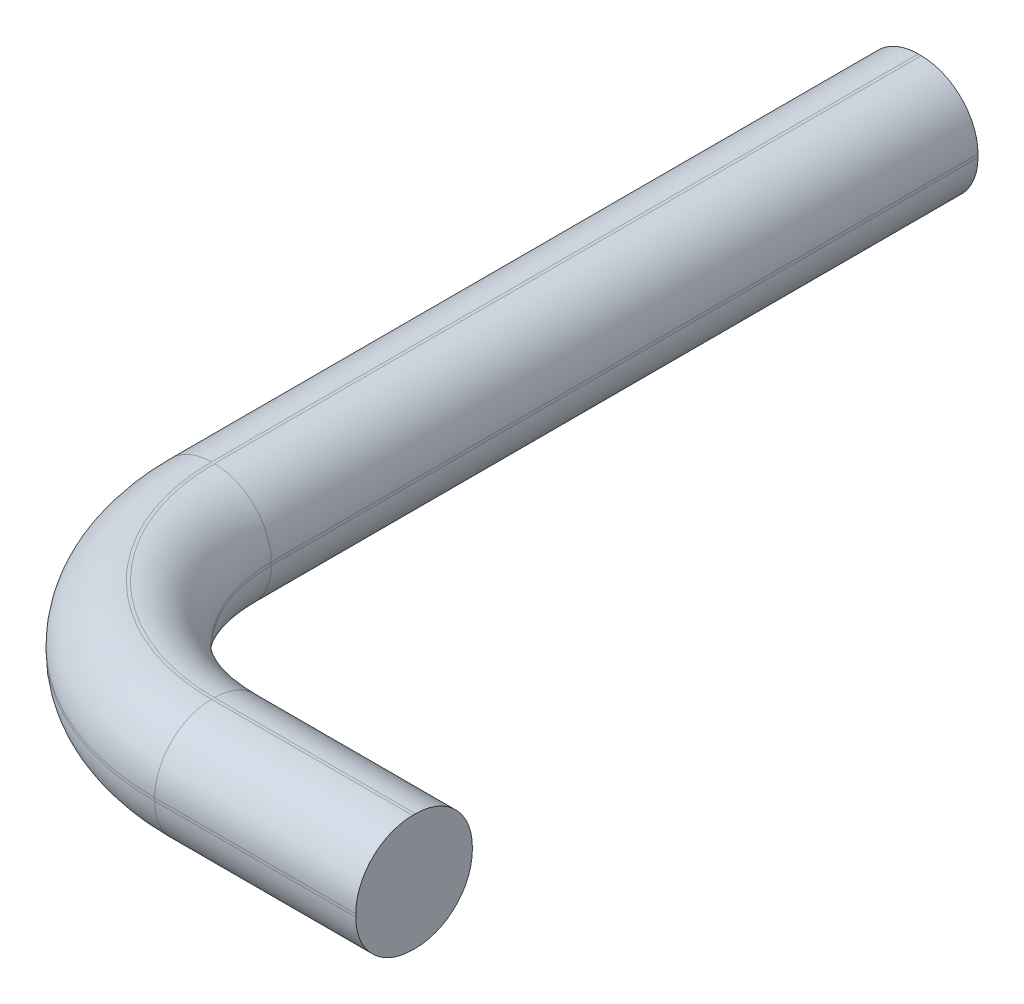
ISO-10303-21;
HEADER;
FILE_DESCRIPTION(('STEP AP214'),'2;1');
FILE_NAME('part.step','',(''),(''),'','','');
FILE_SCHEMA(('AUTOMOTIVE_DESIGN { 1 0 10303 214 1 1 1 1 }'));
ENDSEC;
DATA;
#1=APPLICATION_CONTEXT('core data for automotive mechanical design processes');
#2=APPLICATION_PROTOCOL_DEFINITION('international standard','automotive_design',2000,#1);
#3=PRODUCT_CONTEXT('',#1,'mechanical');
#4=PRODUCT('Part','Part','',(#3));
#5=PRODUCT_RELATED_PRODUCT_CATEGORY('part','',(#4));
#6=PRODUCT_DEFINITION_FORMATION('','',#4);
#7=PRODUCT_DEFINITION_CONTEXT('part definition',#1,'design');
#8=PRODUCT_DEFINITION('design','',#6,#7);
#9=PRODUCT_DEFINITION_SHAPE('','',#8);
#10=(LENGTH_UNIT() NAMED_UNIT(*) SI_UNIT(.MILLI.,.METRE.));
#11=(NAMED_UNIT(*) PLANE_ANGLE_UNIT() SI_UNIT($,.RADIAN.));
#12=(NAMED_UNIT(*) SI_UNIT($,.STERADIAN.) SOLID_ANGLE_UNIT());
#13=UNCERTAINTY_MEASURE_WITH_UNIT(LENGTH_MEASURE(1.E-05),#10,'distance_accuracy_value','');
#14=(GEOMETRIC_REPRESENTATION_CONTEXT(3) GLOBAL_UNCERTAINTY_ASSIGNED_CONTEXT((#13)) GLOBAL_UNIT_ASSIGNED_CONTEXT((#10,
#11,#12)) REPRESENTATION_CONTEXT('',''));
#15=CARTESIAN_POINT('',(0.,0.,0.));
#16=DIRECTION('',(0.,0.,1.));
#17=DIRECTION('',(1.,0.,0.));
#18=AXIS2_PLACEMENT_3D('',#15,#16,#17);
#19=CARTESIAN_POINT('',(1.40000174,-0.00999666000000074,1.85000192));
#20=DIRECTION('',(0.,-1.,0.));
#21=DIRECTION('',(0.,0.,-1.));
#22=AXIS2_PLACEMENT_3D('',#19,#20,#21);
#23=TOROIDAL_SURFACE('',#22,1.39,0.39);
#24=CARTESIAN_POINT('',(1.40000174,-0.00999666,1.85000192));
#25=DIRECTION('',(0.,1.,0.));
#26=DIRECTION('',(0.,0.,1.));
#27=AXIS2_PLACEMENT_3D('',#24,#25,#26);
#28=CIRCLE('',#27,1.);
#29=CARTESIAN_POINT('',(0.40000174,-0.00999666000000025,1.85000192));
#30=VERTEX_POINT('',#29);
#31=CARTESIAN_POINT('',(1.40000174,-0.00999665999999999,2.85000192));
#32=VERTEX_POINT('',#31);
#33=EDGE_CURVE('E126',#30,#32,#28,.T.);
#34=ORIENTED_EDGE('',*,*,#33,.T.);
#35=CARTESIAN_POINT('',(1.40000174,-0.009996659999999,3.24000192));
#36=DIRECTION('',(1.,0.,0.));
#37=DIRECTION('',(0.,0.,-1.));
#38=AXIS2_PLACEMENT_3D('',#35,#36,#37);
#39=CIRCLE('',#38,0.39);
#40=CARTESIAN_POINT('',(1.40000174,-0.39999666,3.24000192));
#41=VERTEX_POINT('',#40);
#42=EDGE_CURVE('E138',#41,#32,#39,.T.);
#43=ORIENTED_EDGE('',*,*,#42,.F.);
#44=CARTESIAN_POINT('',(1.40000174,-0.39999666,3.24000192));
#45=CARTESIAN_POINT('',(1.38254161723122,-0.399996659846562,3.23998878020109));
#46=CARTESIAN_POINT('',(1.36508168573159,-0.39999665937058,3.23965037598821));
#47=CARTESIAN_POINT('',(1.33018679765661,-0.399996658604512,3.23832360261938));
#48=CARTESIAN_POINT('',(1.31275184071402,-0.399996658314424,3.23733524312115));
#49=CARTESIAN_POINT('',(1.27793094909572,-0.39999665875108,3.23470912077804));
#50=CARTESIAN_POINT('',(1.26054501448968,-0.399996659477825,3.23307135701083));
#51=CARTESIAN_POINT('',(1.22584538152621,-0.399996659765057,3.22915183592229));
#52=CARTESIAN_POINT('',(1.20853168445276,-0.399996659325524,3.22687006720321));
#53=CARTESIAN_POINT('',(1.17400267740773,-0.399996659451828,3.22165380404335));
#54=CARTESIAN_POINT('',(1.1567873707991,-0.399996660017699,3.2187192874271));
#55=CARTESIAN_POINT('',(1.12737218735258,-0.399996644761964,3.21317048376076));
#56=CARTESIAN_POINT('',(1.11514442041756,-0.399996633575496,3.21070418702725));
#57=CARTESIAN_POINT('',(1.10236463902564,-0.399996634639923,3.20790602573824));
#58=CARTESIAN_POINT('',(1.10176852045032,-0.399996634718802,3.20777499895823));
#59=CARTESIAN_POINT('',(1.09162314515006,-0.399996636176326,3.20553768664782));
#60=CARTESIAN_POINT('',(1.0820970931742,-0.399996639280515,3.20332593874988));
#61=CARTESIAN_POINT('',(1.051542600593,-0.399996647771027,3.19589335358894));
#62=CARTESIAN_POINT('',(1.030607501279,-0.399996651344889,3.19028275899251));
#63=CARTESIAN_POINT('',(0.992813767303309,-0.399996656552856,3.17919680927334));
#64=CARTESIAN_POINT('',(0.975907473205403,-0.39999665842176,3.17388311766191));
#65=CARTESIAN_POINT('',(0.951864766692174,-0.399996659603419,3.16582235503647));
#66=CARTESIAN_POINT('',(0.944640639414638,-0.399996659765442,3.16333441568982));
#67=CARTESIAN_POINT('',(0.920356195575256,-0.399996660120523,3.1547521927208));
#68=CARTESIAN_POINT('',(0.903389544461029,-0.399996660051574,3.14839014551357));
#69=CARTESIAN_POINT('',(0.869336001733168,-0.399996659654266,3.13487121405977));
#70=CARTESIAN_POINT('',(0.852254900333459,-0.399996659320142,3.12769974129958));
#71=CARTESIAN_POINT('',(0.82795004690626,-0.399996654020011,3.1169326222548));
#72=CARTESIAN_POINT('',(0.82060680315735,-0.399996651776191,3.11360460301237));
#73=CARTESIAN_POINT('',(0.803493314382053,-0.399996644896891,3.10566891938135));
#74=CARTESIAN_POINT('',(0.793746429278848,-0.399996639707749,3.10101076492236));
#75=CARTESIAN_POINT('',(0.76709686868581,-0.399996624664594,3.08788586615864));
#76=CARTESIAN_POINT('',(0.750309884486389,-0.399996614230785,3.07918285354314));
#77=CARTESIAN_POINT('',(0.717108351028278,-0.399996595116086,3.0610928515831));
#78=CARTESIAN_POINT('',(0.700693815733734,-0.39999658643526,3.05170583664879));
#79=CARTESIAN_POINT('',(0.668265067277369,-0.399996573560346,3.03226306688683));
#80=CARTESIAN_POINT('',(0.652250862291193,-0.399996569366349,3.02220729841703));
#81=CARTESIAN_POINT('',(0.620650482366615,-0.399996566530954,3.00144432435559));
#82=CARTESIAN_POINT('',(0.605064308875785,-0.399996567889576,2.99073711656121));
#83=CARTESIAN_POINT('',(0.57434616587978,-0.399996575840701,2.96869013944672));
#84=CARTESIAN_POINT('',(0.55921419018123,-0.399996582433133,2.95735037875805));
#85=CARTESIAN_POINT('',(0.529432448483669,-0.399996598941389,2.93405565200829));
#86=CARTESIAN_POINT('',(0.514782667711464,-0.399996608857111,2.92210070482374));
#87=CARTESIAN_POINT('',(0.485982759757446,-0.399996629054595,2.89760410755589));
#88=CARTESIAN_POINT('',(0.471832608779942,-0.399996639336339,2.88506248548028));
#89=CARTESIAN_POINT('',(0.444084771331925,-0.399996654288872,2.85938441115315));
#90=CARTESIAN_POINT('',(0.430487049166163,-0.399996658960023,2.84624799745051));
#91=CARTESIAN_POINT('',(0.410741452787805,-0.399996660496642,2.82649661411751));
#92=CARTESIAN_POINT('',(0.404412953293253,-0.399996660165178,2.82006014749714));
#93=CARTESIAN_POINT('',(0.382652163214097,-0.399996657404838,2.79749417084749));
#94=CARTESIAN_POINT('',(0.367540662068428,-0.399996652605715,2.78105175393447));
#95=CARTESIAN_POINT('',(0.342193059485388,-0.399996635012537,2.75210817704091));
#96=CARTESIAN_POINT('',(0.331764417312967,-0.399996624796593,2.73977461376898));
#97=CARTESIAN_POINT('',(0.314995129558844,-0.399996604989868,2.71922335916537));
#98=CARTESIAN_POINT('',(0.308525786371919,-0.399996596481085,2.71111043215507));
#99=CARTESIAN_POINT('',(0.290288078726695,-0.399996572967514,2.68769872096893));
#100=CARTESIAN_POINT('',(0.278747820338567,-0.399996558670007,2.67222104540047));
#101=CARTESIAN_POINT('',(0.257458984512901,-0.39999654240396,2.64236569349999));
#102=CARTESIAN_POINT('',(0.247646761236898,-0.399996539343315,2.62803325493206));
#103=CARTESIAN_POINT('',(0.227707662016869,-0.399996542017604,2.59768418829407));
#104=CARTESIAN_POINT('',(0.21763336681335,-0.399996548578021,2.58163296022035));
#105=CARTESIAN_POINT('',(0.198153879921357,-0.399996564443457,2.54913034250607));
#106=CARTESIAN_POINT('',(0.188748670222657,-0.399996573748402,2.53267896365265));
#107=CARTESIAN_POINT('',(0.170625420395982,-0.399996594737633,2.49940277501005));
#108=CARTESIAN_POINT('',(0.161907351979788,-0.39999660642182,2.48257798063021));
#109=CARTESIAN_POINT('',(0.145171644702205,-0.399996628592384,2.44858471096724));
#110=CARTESIAN_POINT('',(0.137153967027075,-0.399996639078827,2.43141625479381));
#111=CARTESIAN_POINT('',(0.121837230717636,-0.399996654750107,2.39676312886546));
#112=CARTESIAN_POINT('',(0.114538122022078,-0.399996659935313,2.37927848123957));
#113=CARTESIAN_POINT('',(0.101205077540172,-0.399996660059552,2.34542804965422));
#114=CARTESIAN_POINT('',(0.0951167033537137,-0.39999665577943,2.32908365555782));
#115=CARTESIAN_POINT('',(0.0835391063335781,-0.399996650224027,2.29618492391118));
#116=CARTESIAN_POINT('',(0.0780498570965774,-0.399996648948612,2.27963059564862));
#117=CARTESIAN_POINT('',(0.0676781679102354,-0.399996649772731,2.24633259126403));
#118=CARTESIAN_POINT('',(0.0627957266594672,-0.399996651872257,2.2295889155482));
#119=CARTESIAN_POINT('',(0.0536558747492859,-0.39999666128969,2.19593202897013));
#120=CARTESIAN_POINT('',(0.0493984889731157,-0.399996668607804,2.17901881138711));
#121=CARTESIAN_POINT('',(0.0414660442275104,-0.399996646317901,2.14505300174933));
#122=CARTESIAN_POINT('',(0.0377910328845431,-0.399996616706865,2.12800039841541));
#123=CARTESIAN_POINT('',(0.0329074275812208,-0.399996606910779,2.10258411228187));
#124=CARTESIAN_POINT('',(0.0314045382214364,-0.399996609107714,2.09427651266294));
#125=CARTESIAN_POINT('',(0.026534092804882,-0.399996618857502,2.06586003023302));
#126=CARTESIAN_POINT('',(0.0235371861522367,-0.399996629590212,2.04568616306871));
#127=CARTESIAN_POINT('',(0.019152463531509,-0.39999664394367,2.01089761598544));
#128=CARTESIAN_POINT('',(0.0175490783009313,-0.399996648714616,1.99630952540659));
#129=CARTESIAN_POINT('',(0.0151285559038876,-0.399996654865006,1.97054674289664));
#130=CARTESIAN_POINT('',(0.0142151496779594,-0.399996656779787,1.95938102092349));
#131=CARTESIAN_POINT('',(0.0121278994839748,-0.399996660043117,1.92946172233904));
#132=CARTESIAN_POINT('',(0.011196628661945,-0.399996660129922,1.91069066268616));
#133=CARTESIAN_POINT('',(0.0102204229804734,-0.399996659881553,1.87794357250099));
#134=CARTESIAN_POINT('',(0.0100094391291838,-0.399996659648883,1.86397230233798));
#135=CARTESIAN_POINT('',(0.01000174,-0.39999666,1.85000192));
#136=B_SPLINE_CURVE_WITH_KNOTS('',3,(#44,#45,#46,#47,#48,#49,#50,#51,#52,#53,#54,#55,#56,#57,
#58,#59,#60,#61,#62,#63,#64,#65,#66,#67,#68,#69,#70,#71,#72,#73,#74,#75,#76,#77,#78,#79,#80,#81,
#82,#83,#84,#85,#86,#87,#88,#89,#90,#91,#92,#93,#94,#95,#96,#97,#98,#99,#100,#101,#102,#103,
#104,#105,#106,#107,#108,#109,#110,#111,#112,#113,#114,#115,#116,#117,#118,#119,#120,#121,#122,
#123,#124,#125,#126,#127,#128,#129,#130,#131,#132,#133,#134,#135),.UNSPECIFIED.,.F.,.F.,(4,2,2,
2,2,2,2,2,2,2,2,2,2,2,2,2,2,2,2,2,2,2,2,2,2,2,2,2,2,2,2,2,2,2,2,2,2,2,2,2,2,2,2,2,2,4),(0.,
0.052377462226915,0.104754146193331,0.157130904550227,0.209508589941971,0.261888055005389,
0.299304580452954,0.301135625968602,0.330471991152891,0.395467518809021,0.448619154842294,
0.471540149328903,0.525886551565373,0.58144779728417,0.605633443638485,0.63803901741383,
0.694748386052567,0.751459877382067,0.808172525943378,0.86488536627941,0.921597432935873,
0.978307760462204,1.03501538341254,1.09171933634679,1.1187983502565,1.18576345963672,
1.234208888882,1.26533629215048,1.32323613603675,1.37533264561107,1.43216848939226,
1.48900280270543,1.54583477504139,1.60266359590425,1.65948845481203,1.71180148419425,
1.76411220721947,1.81642281805143,1.86873551078644,1.92105247943796,1.94637854247432,
2.00754130420251,2.05156219356035,2.08516843199477,2.14153466054272,2.1834465073254),.UNSPECIFIED.);
#137=CARTESIAN_POINT('',(0.01000174,-0.39999666,1.85000192));
#138=VERTEX_POINT('',#137);
#139=EDGE_CURVE('E196',#41,#138,#136,.T.);
#140=ORIENTED_EDGE('',*,*,#139,.T.);
#141=CARTESIAN_POINT('',(0.0100017399999999,-0.00999665999999999,1.85000192));
#142=DIRECTION('',(0.,0.,1.));
#143=DIRECTION('',(1.,0.,0.));
#144=AXIS2_PLACEMENT_3D('',#141,#142,#143);
#145=CIRCLE('',#144,0.39);
#146=EDGE_CURVE('E185',#138,#30,#145,.T.);
#147=ORIENTED_EDGE('',*,*,#146,.T.);
#148=EDGE_LOOP('',(#34,#43,#140,#147));
#149=FACE_BOUND('',#148,.T.);
#150=ADVANCED_FACE('F17',(#149),#23,.T.);
#151=CARTESIAN_POINT('',(-0.009996659999999,-0.00999666,1.85000032));
#152=DIRECTION('',(0.,0.,-1.));
#153=DIRECTION('',(0.,1.,0.));
#154=AXIS2_PLACEMENT_3D('',#151,#152,#153);
#155=CYLINDRICAL_SURFACE('',#154,0.39);
#156=CARTESIAN_POINT('',(-0.00999665999999992,-0.00999665999999992,1.85000032));
#157=DIRECTION('',(0.,0.,1.));
#158=DIRECTION('',(1.,0.,0.));
#159=AXIS2_PLACEMENT_3D('',#156,#157,#158);
#160=CIRCLE('',#159,0.39);
#161=CARTESIAN_POINT('',(-0.39999666,-0.00999665999999998,1.85000032));
#162=VERTEX_POINT('',#161);
#163=CARTESIAN_POINT('',(-0.00999665999999955,-0.39999666,1.85000032));
#164=VERTEX_POINT('',#163);
#165=EDGE_CURVE('E115',#162,#164,#160,.T.);
#166=ORIENTED_EDGE('',*,*,#165,.F.);
#167=DIRECTION('',(0.,0.,-1.));
#168=VECTOR('',#167,1.);
#169=CARTESIAN_POINT('',(-0.39999666,-0.00999665999999998,3.65000032));
#170=LINE('',#169,#168);
#171=CARTESIAN_POINT('',(-0.39999666,-0.00999666000000053,-2.99999908));
#172=VERTEX_POINT('',#171);
#173=EDGE_CURVE('E141',#162,#172,#170,.T.);
#174=ORIENTED_EDGE('',*,*,#173,.T.);
#175=CARTESIAN_POINT('',(-0.009996659999999,-0.00999666000000108,-2.99999908));
#176=DIRECTION('',(0.,0.,-1.));
#177=DIRECTION('',(0.,1.,0.));
#178=AXIS2_PLACEMENT_3D('',#175,#176,#177);
#179=CIRCLE('',#178,0.39);
#180=CARTESIAN_POINT('',(-0.00999665999999903,-0.399996660000002,-2.99999908));
#181=VERTEX_POINT('',#180);
#182=EDGE_CURVE('E21',#172,#181,#179,.F.);
#183=ORIENTED_EDGE('',*,*,#182,.T.);
#184=DIRECTION('',(0.,0.,1.));
#185=VECTOR('',#184,1.);
#186=CARTESIAN_POINT('',(-0.00999665999999906,-0.39999666,3.65000032));
#187=LINE('',#186,#185);
#188=EDGE_CURVE('E137',#181,#164,#187,.T.);
#189=ORIENTED_EDGE('',*,*,#188,.T.);
#190=EDGE_LOOP('',(#166,#174,#183,#189));
#191=FACE_BOUND('',#190,.T.);
#192=ADVANCED_FACE('F140',(#191),#155,.T.);
#193=CARTESIAN_POINT('',(1.40000334,-0.00999665999999992,1.85000032));
#194=DIRECTION('',(0.,1.,0.));
#195=DIRECTION('',(0.,0.,1.));
#196=AXIS2_PLACEMENT_3D('',#193,#194,#195);
#197=TOROIDAL_SURFACE('',#196,1.41,0.39);
#198=CARTESIAN_POINT('',(1.40000334,-0.00999665999999998,1.85000032));
#199=DIRECTION('',(0.,-1.,0.));
#200=DIRECTION('',(0.,0.,-1.));
#201=AXIS2_PLACEMENT_3D('',#198,#199,#200);
#202=CIRCLE('',#201,1.8);
#203=CARTESIAN_POINT('',(1.40000334,-0.00999665999999915,3.65000032));
#204=VERTEX_POINT('',#203);
#205=EDGE_CURVE('E163',#162,#204,#202,.F.);
#206=ORIENTED_EDGE('',*,*,#205,.F.);
#207=ORIENTED_EDGE('',*,*,#165,.T.);
#208=CARTESIAN_POINT('',(-0.00999665999999906,-0.39999666,1.85000032));
#209=CARTESIAN_POINT('',(-0.00998352107914238,-0.399996659844928,1.8677115666795));
#210=CARTESIAN_POINT('',(-0.00964041687337694,-0.399996659371566,1.88542262234074));
#211=CARTESIAN_POINT('',(-0.00829485428694371,-0.399996658617031,1.92081940760026));
#212=CARTESIAN_POINT('',(-0.00729240555015082,-0.399996658335855,1.93850513756518));
#213=CARTESIAN_POINT('',(-0.00462872780731383,-0.399996658794413,1.9738268744148));
#214=CARTESIAN_POINT('',(-0.00296749777655909,-0.399996659534147,1.99146288122211));
#215=CARTESIAN_POINT('',(0.00100827684292671,-0.399996659781329,2.02666161427884));
#216=CARTESIAN_POINT('',(0.00332283301906032,-0.399996659288755,2.04422433922292));
#217=CARTESIAN_POINT('',(0.00861403316165931,-0.399996659314685,2.07924999529904));
#218=CARTESIAN_POINT('',(0.0115906995821845,-0.399996659833223,2.09671292302607));
#219=CARTESIAN_POINT('',(0.017219459354537,-0.399996644023387,2.12655115288343));
#220=CARTESIAN_POINT('',(0.019721363457196,-0.39999663246526,2.138954761559));
#221=CARTESIAN_POINT('',(0.0225605069386392,-0.399996633521804,2.15192239303424));
#222=CARTESIAN_POINT('',(0.0226942951905512,-0.399996633601898,2.15253109435625));
#223=CARTESIAN_POINT('',(0.024966229424892,-0.399996635081829,2.16283351493937));
#224=CARTESIAN_POINT('',(0.0272116670991298,-0.399996638334315,2.17250362642836));
#225=CARTESIAN_POINT('',(0.03475291339218,-0.399996647213662,2.20350082757487));
#226=CARTESIAN_POINT('',(0.0404436919135287,-0.399996650932124,2.22473331270553));
#227=CARTESIAN_POINT('',(0.0516867741119526,-0.399996656369164,2.26306005770272));
#228=CARTESIAN_POINT('',(0.0570749862157814,-0.399996658328813,2.28020269563596));
#229=CARTESIAN_POINT('',(0.0652514986321339,-0.399996659574781,2.30459026584079));
#230=CARTESIAN_POINT('',(0.0677772951610093,-0.399996659747435,2.31192405559619));
#231=CARTESIAN_POINT('',(0.0764874677106922,-0.399996660125177,2.33656918365546));
#232=CARTESIAN_POINT('',(0.0829435868406816,-0.399996660050672,2.35378545949878));
#233=CARTESIAN_POINT('',(0.0966583013960084,-0.399996659646231,2.38832919735584));
#234=CARTESIAN_POINT('',(0.103931284132049,-0.399996659310781,2.40565094844071));
#235=CARTESIAN_POINT('',(0.114849205689108,-0.399996653888016,2.43029513414364));
#236=CARTESIAN_POINT('',(0.11822279057757,-0.399996651592008,2.43773872938047));
#237=CARTESIAN_POINT('',(0.126270255897951,-0.399996644544748,2.45509313840785));
#238=CARTESIAN_POINT('',(0.130995441203816,-0.399996639223407,2.46498021517258));
#239=CARTESIAN_POINT('',(0.14430920116342,-0.399996623793766,2.49201308214261));
#240=CARTESIAN_POINT('',(0.153137439764874,-0.399996613088466,2.50904151756117));
#241=CARTESIAN_POINT('',(0.171487719188491,-0.399996593472363,2.54272060042768));
#242=CARTESIAN_POINT('',(0.181009785928912,-0.399996584561626,2.55937123373217));
#243=CARTESIAN_POINT('',(0.200732267513231,-0.399996571342513,2.59226642455449));
#244=CARTESIAN_POINT('',(0.210932696170543,-0.39999656703423,2.608510973794));
#245=CARTESIAN_POINT('',(0.231994349609914,-0.399996564115338,2.64056589209715));
#246=CARTESIAN_POINT('',(0.242855576615449,-0.399996565504749,2.65637625969958));
#247=CARTESIAN_POINT('',(0.265219682990525,-0.399996573655434,2.68753626295645));
#248=CARTESIAN_POINT('',(0.276722553606815,-0.399996580416633,2.70288590489169));
#249=CARTESIAN_POINT('',(0.300352332859584,-0.399996597350539,2.73309605871303));
#250=CARTESIAN_POINT('',(0.312479222363158,-0.399996607523139,2.7479565855729));
#251=CARTESIAN_POINT('',(0.337328162805987,-0.399996628246695,2.77717078076275));
#252=CARTESIAN_POINT('',(0.350050185359657,-0.399996638797631,2.79152447320961));
#253=CARTESIAN_POINT('',(0.376097506736936,-0.39999665413799,2.81967155962971));
#254=CARTESIAN_POINT('',(0.389422766502634,-0.399996658927786,2.83346498976896));
#255=CARTESIAN_POINT('',(0.409471486705325,-0.399996660513074,2.85350761800444));
#256=CARTESIAN_POINT('',(0.416013948305489,-0.399996660174898,2.85993996313712));
#257=CARTESIAN_POINT('',(0.438914871004804,-0.399996657350548,2.88202174482898));
#258=CARTESIAN_POINT('',(0.455590181933389,-0.399996652440644,2.89734631763034));
#259=CARTESIAN_POINT('',(0.484937695022043,-0.399996634384997,2.92304628827133));
#260=CARTESIAN_POINT('',(0.497439793066526,-0.399996623896236,2.93361711649262));
#261=CARTESIAN_POINT('',(0.518280888101478,-0.399996603539685,2.95062285731348));
#262=CARTESIAN_POINT('',(0.526513941438644,-0.399996594785246,2.95718791623118));
#263=CARTESIAN_POINT('',(0.550267851569903,-0.399996570583807,2.9756918207901));
#264=CARTESIAN_POINT('',(0.565970164844896,-0.399996555852201,2.98739928495775));
#265=CARTESIAN_POINT('',(0.596252152553658,-0.399996539056732,3.00899171697131));
#266=CARTESIAN_POINT('',(0.610785747588269,-0.399996535867089,3.0189415170075));
#267=CARTESIAN_POINT('',(0.641566089386302,-0.399996538541783,3.03916395544117));
#268=CARTESIAN_POINT('',(0.657848059140232,-0.399996545259748,3.04938306667955));
#269=CARTESIAN_POINT('',(0.690817917082254,-0.399996561545753,3.06914255448053));
#270=CARTESIAN_POINT('',(0.707505794291829,-0.399996571113716,3.07868294937293));
#271=CARTESIAN_POINT('',(0.741260350094394,-0.399996592717916,3.09706667989064));
#272=CARTESIAN_POINT('',(0.758327013005337,-0.39999660475405,3.10591004430488));
#273=CARTESIAN_POINT('',(0.792808960019338,-0.399996627603857,3.12288626442289));
#274=CARTESIAN_POINT('',(0.810224224674982,-0.399996638417596,3.13101915962651));
#275=CARTESIAN_POINT('',(0.845375514573537,-0.399996654582077,3.1465559816532));
#276=CARTESIAN_POINT('',(0.863111517296425,-0.399996659933199,3.15395995942243));
#277=CARTESIAN_POINT('',(0.897449165103649,-0.399996660061499,3.16748480928652));
#278=CARTESIAN_POINT('',(0.91402912225459,-0.399996655644175,3.17366087890502));
#279=CARTESIAN_POINT('',(0.947401990343908,-0.399996649910599,3.18540525068134));
#280=CARTESIAN_POINT('',(0.964194891778677,-0.399996648594207,3.19097357985655));
#281=CARTESIAN_POINT('',(0.99797276168589,-0.399996649447779,3.20149469230421));
#282=CARTESIAN_POINT('',(1.01495772968535,-0.399996651617733,3.20644747709213));
#283=CARTESIAN_POINT('',(1.04909963345,-0.399996661329716,3.21571903385639));
#284=CARTESIAN_POINT('',(1.06625657598997,-0.399996668871958,3.22003778074965));
#285=CARTESIAN_POINT('',(1.10071184441603,-0.399996645882966,3.22808453084606));
#286=CARTESIAN_POINT('',(1.11801018171887,-0.399996615348626,3.23181248584086));
#287=CARTESIAN_POINT('',(1.14380271147926,-0.399996605146108,3.23676848906161));
#288=CARTESIAN_POINT('',(1.15224006445127,-0.399996607373823,3.23829479294725));
#289=CARTESIAN_POINT('',(1.18107208322134,-0.399996617347225,3.24323584840802));
#290=CARTESIAN_POINT('',(1.20153261581382,-0.399996628443057,3.24627485790811));
#291=CARTESIAN_POINT('',(1.2368110291673,-0.399996643284973,3.25072066532888));
#292=CARTESIAN_POINT('',(1.25160193626222,-0.39999664821962,3.25234618984365));
#293=CARTESIAN_POINT('',(1.27774440552417,-0.399996654606625,3.2548022932449));
#294=CARTESIAN_POINT('',(1.28908692488511,-0.399996656604958,3.25572991879472));
#295=CARTESIAN_POINT('',(1.31946057052176,-0.399996660018541,3.25784765407957));
#296=CARTESIAN_POINT('',(1.33850941759578,-0.399996660127932,3.25879175215581));
#297=CARTESIAN_POINT('',(1.37171015525831,-0.399996659887017,3.25977950653284));
#298=CARTESIAN_POINT('',(1.38585719825141,-0.399996659648056,3.25999265856979));
#299=CARTESIAN_POINT('',(1.40000334,-0.39999666,3.26000032));
#300=B_SPLINE_CURVE_WITH_KNOTS('',3,(#208,#209,#210,#211,#212,#213,#214,#215,#216,#217,#218,
#219,#220,#221,#222,#223,#224,#225,#226,#227,#228,#229,#230,#231,#232,#233,#234,#235,#236,#237,
#238,#239,#240,#241,#242,#243,#244,#245,#246,#247,#248,#249,#250,#251,#252,#253,#254,#255,#256,
#257,#258,#259,#260,#261,#262,#263,#264,#265,#266,#267,#268,#269,#270,#271,#272,#273,#274,#275,
#276,#277,#278,#279,#280,#281,#282,#283,#284,#285,#286,#287,#288,#289,#290,#291,#292,#293,#294,
#295,#296,#297,#298,#299),.UNSPECIFIED.,.F.,.F.,(4,2,2,2,2,2,2,2,2,2,2,2,2,2,2,2,2,2,2,2,2,2,2,
2,2,2,2,2,2,2,2,2,2,2,2,2,2,2,2,2,2,2,2,2,2,4),(0.,0.0531307903801626,0.106260803662347,
0.159390899586685,0.212521937886437,0.265654778287062,0.303609462011127,0.305479154138469,
0.335259321804703,0.401178512020821,0.455073410869489,0.478342433600537,0.533488899595865,
0.589833490611653,0.614349761322374,0.647221472629137,0.704746573165702,0.762273823680755,
0.819802245976222,0.877330861855997,0.934858693126883,0.992384761599535,1.04990808908944,
1.10742769741799,1.13495185833365,1.20286353264512,1.25197035209717,1.28355851083735,
1.34229817686641,1.39512563986587,1.45277850742175,1.5104298173795,1.56807874496057,
1.62572446540028,1.68336615394856,1.73643308806727,1.7894976621097,1.84256210550379,
1.89562864760681,1.94869951768969,1.97442110373087,2.03645276278278,2.08108562910938,
2.11522391676879,2.17242413227566,2.2148632728208),.UNSPECIFIED.);
#301=CARTESIAN_POINT('',(1.40000334,-0.39999666,3.26000032));
#302=VERTEX_POINT('',#301);
#303=EDGE_CURVE('E147',#164,#302,#300,.T.);
#304=ORIENTED_EDGE('',*,*,#303,.T.);
#305=CARTESIAN_POINT('',(1.40000334,-0.009996659999999,3.26000032));
#306=DIRECTION('',(-1.,0.,0.));
#307=DIRECTION('',(0.,0.,1.));
#308=AXIS2_PLACEMENT_3D('',#305,#306,#307);
#309=CIRCLE('',#308,0.39);
#310=EDGE_CURVE('E171',#204,#302,#309,.F.);
#311=ORIENTED_EDGE('',*,*,#310,.F.);
#312=EDGE_LOOP('',(#206,#207,#304,#311));
#313=FACE_BOUND('',#312,.T.);
#314=ADVANCED_FACE('F213',(#313),#197,.T.);
#315=CARTESIAN_POINT('',(2.78000206,-0.009996659999999,3.26000032));
#316=DIRECTION('',(-1.,0.,0.));
#317=DIRECTION('',(0.,0.,1.));
#318=AXIS2_PLACEMENT_3D('',#315,#316,#317);
#319=CYLINDRICAL_SURFACE('',#318,0.39);
#320=CARTESIAN_POINT('',(2.78000206,-0.009996659999999,3.26000032));
#321=DIRECTION('',(-1.,0.,0.));
#322=DIRECTION('',(0.,0.,1.));
#323=AXIS2_PLACEMENT_3D('',#320,#321,#322);
#324=CIRCLE('',#323,0.39);
#325=CARTESIAN_POINT('',(2.78000206,-0.39999666,3.26000032));
#326=VERTEX_POINT('',#325);
#327=CARTESIAN_POINT('',(2.78000206,-0.00999665999999896,3.65000032));
#328=VERTEX_POINT('',#327);
#329=EDGE_CURVE('E174',#326,#328,#324,.T.);
#330=ORIENTED_EDGE('',*,*,#329,.T.);
#331=DIRECTION('',(1.,0.,0.));
#332=VECTOR('',#331,1.);
#333=CARTESIAN_POINT('',(2.78000206,-0.00999665999999901,3.65000032));
#334=LINE('',#333,#332);
#335=EDGE_CURVE('E159',#328,#204,#334,.F.);
#336=ORIENTED_EDGE('',*,*,#335,.T.);
#337=ORIENTED_EDGE('',*,*,#310,.T.);
#338=DIRECTION('',(1.,0.,0.));
#339=VECTOR('',#338,1.);
#340=CARTESIAN_POINT('',(2.78000206,-0.39999666,3.26000032));
#341=LINE('',#340,#339);
#342=EDGE_CURVE('E149',#302,#326,#341,.T.);
#343=ORIENTED_EDGE('',*,*,#342,.T.);
#344=EDGE_LOOP('',(#330,#336,#337,#343));
#345=FACE_BOUND('',#344,.T.);
#346=ADVANCED_FACE('F216',(#345),#319,.T.);
#347=CARTESIAN_POINT('',(1.40000174,-0.009996659999999,3.24000192));
#348=DIRECTION('',(1.,0.,0.));
#349=DIRECTION('',(0.,0.,-1.));
#350=AXIS2_PLACEMENT_3D('',#347,#348,#349);
#351=CYLINDRICAL_SURFACE('',#350,0.39);
#352=ORIENTED_EDGE('',*,*,#42,.T.);
#353=DIRECTION('',(1.,0.,0.));
#354=VECTOR('',#353,1.);
#355=CARTESIAN_POINT('',(0.40000174,-0.00999665999999998,2.85000192));
#356=LINE('',#355,#354);
#357=CARTESIAN_POINT('',(2.78000206,-0.00999665999999949,2.85000192));
#358=VERTEX_POINT('',#357);
#359=EDGE_CURVE('E329',#32,#358,#356,.T.);
#360=ORIENTED_EDGE('',*,*,#359,.T.);
#361=CARTESIAN_POINT('',(2.78000206,-0.009996659999999,3.24000192));
#362=DIRECTION('',(1.,0.,0.));
#363=DIRECTION('',(0.,0.,-1.));
#364=AXIS2_PLACEMENT_3D('',#361,#362,#363);
#365=CIRCLE('',#364,0.39);
#366=CARTESIAN_POINT('',(2.78000206,-0.39999666,3.24000192));
#367=VERTEX_POINT('',#366);
#368=EDGE_CURVE('E156',#358,#367,#365,.F.);
#369=ORIENTED_EDGE('',*,*,#368,.T.);
#370=DIRECTION('',(1.,0.,0.));
#371=VECTOR('',#370,1.);
#372=CARTESIAN_POINT('',(2.78000206,-0.39999666,3.24000192));
#373=LINE('',#372,#371);
#374=EDGE_CURVE('E192',#367,#41,#373,.F.);
#375=ORIENTED_EDGE('',*,*,#374,.T.);
#376=EDGE_LOOP('',(#352,#360,#369,#375));
#377=FACE_BOUND('',#376,.T.);
#378=ADVANCED_FACE('F365',(#377),#351,.T.);
#379=CARTESIAN_POINT('',(2.78000206,-0.39999666,3.65000032));
#380=DIRECTION('',(0.,1.,0.));
#381=DIRECTION('',(0.,0.,1.));
#382=AXIS2_PLACEMENT_3D('',#379,#380,#381);
#383=PLANE('',#382);
#384=ORIENTED_EDGE('',*,*,#374,.F.);
#385=DIRECTION('',(0.,0.,1.));
#386=VECTOR('',#385,1.);
#387=CARTESIAN_POINT('',(2.78000206,-0.39999666,3.65000032));
#388=LINE('',#387,#386);
#389=EDGE_CURVE('E190',#326,#367,#388,.F.);
#390=ORIENTED_EDGE('',*,*,#389,.F.);
#391=ORIENTED_EDGE('',*,*,#342,.F.);
#392=ORIENTED_EDGE('',*,*,#303,.F.);
#393=ORIENTED_EDGE('',*,*,#188,.F.);
#394=DIRECTION('',(1.,0.,0.));
#395=VECTOR('',#394,1.);
#396=CARTESIAN_POINT('',(2.78000206,-0.399996660000002,-2.99999908));
#397=LINE('',#396,#395);
#398=CARTESIAN_POINT('',(0.01000174,-0.399996660000001,-2.99999908));
#399=VERTEX_POINT('',#398);
#400=EDGE_CURVE('E129',#399,#181,#397,.F.);
#401=ORIENTED_EDGE('',*,*,#400,.F.);
#402=DIRECTION('',(0.,0.,1.));
#403=VECTOR('',#402,1.);
#404=CARTESIAN_POINT('',(0.01000174,-0.399996660000001,-2.99999908));
#405=LINE('',#404,#403);
#406=EDGE_CURVE('E339',#138,#399,#405,.F.);
#407=ORIENTED_EDGE('',*,*,#406,.F.);
#408=ORIENTED_EDGE('',*,*,#139,.F.);
#409=EDGE_LOOP('',(#384,#390,#391,#392,#393,#401,#407,#408));
#410=FACE_BOUND('',#409,.T.);
#411=ADVANCED_FACE('F145',(#410),#383,.F.);
#412=CARTESIAN_POINT('',(1.40000174,0.40000174,1.85000192));
#413=DIRECTION('',(0.,-1.,0.));
#414=DIRECTION('',(0.,0.,-1.));
#415=AXIS2_PLACEMENT_3D('',#412,#413,#414);
#416=CYLINDRICAL_SURFACE('',#415,1.);
#417=ORIENTED_EDGE('',*,*,#33,.F.);
#418=DIRECTION('',(0.,-1.,0.));
#419=VECTOR('',#418,1.);
#420=CARTESIAN_POINT('',(0.40000174,0.40000174,1.85000192));
#421=LINE('',#420,#419);
#422=CARTESIAN_POINT('',(0.40000174,0.01000174,1.85000192));
#423=VERTEX_POINT('',#422);
#424=EDGE_CURVE('E182',#423,#30,#421,.T.);
#425=ORIENTED_EDGE('',*,*,#424,.F.);
#426=CARTESIAN_POINT('',(1.40000174,0.01000174,1.85000192));
#427=DIRECTION('',(0.,-1.,0.));
#428=DIRECTION('',(1.,0.,0.));
#429=AXIS2_PLACEMENT_3D('',#426,#427,#428);
#430=CIRCLE('',#429,1.);
#431=CARTESIAN_POINT('',(1.40000174,0.01000174,2.85000192));
#432=VERTEX_POINT('',#431);
#433=EDGE_CURVE('E308',#432,#423,#430,.T.);
#434=ORIENTED_EDGE('',*,*,#433,.F.);
#435=DIRECTION('',(0.,-1.,0.));
#436=VECTOR('',#435,1.);
#437=CARTESIAN_POINT('',(1.40000174,0.40000174,2.85000192));
#438=LINE('',#437,#436);
#439=EDGE_CURVE('E327',#432,#32,#438,.T.);
#440=ORIENTED_EDGE('',*,*,#439,.T.);
#441=EDGE_LOOP('',(#417,#425,#434,#440));
#442=FACE_BOUND('',#441,.T.);
#443=ADVANCED_FACE('F370',(#442),#416,.F.);
#444=CARTESIAN_POINT('',(-0.39999666,0.40000174,3.65000032));
#445=DIRECTION('',(1.,0.,0.));
#446=DIRECTION('',(0.,0.,-1.));
#447=AXIS2_PLACEMENT_3D('',#444,#445,#446);
#448=PLANE('',#447);
#449=ORIENTED_EDGE('',*,*,#173,.F.);
#450=DIRECTION('',(0.,-1.,0.));
#451=VECTOR('',#450,1.);
#452=CARTESIAN_POINT('',(-0.39999666,0.40000174,1.85000032));
#453=LINE('',#452,#451);
#454=CARTESIAN_POINT('',(-0.39999666,0.0100017400000002,1.85000032));
#455=VERTEX_POINT('',#454);
#456=EDGE_CURVE('E168',#455,#162,#453,.T.);
#457=ORIENTED_EDGE('',*,*,#456,.F.);
#458=DIRECTION('',(0.,0.,-1.));
#459=VECTOR('',#458,1.);
#460=CARTESIAN_POINT('',(-0.399996659999999,0.010001740000001,1.85000032));
#461=LINE('',#460,#459);
#462=CARTESIAN_POINT('',(-0.39999666,0.0100017399999994,-2.99999908));
#463=VERTEX_POINT('',#462);
#464=EDGE_CURVE('E307',#463,#455,#461,.F.);
#465=ORIENTED_EDGE('',*,*,#464,.F.);
#466=DIRECTION('',(0.,1.,0.));
#467=VECTOR('',#466,1.);
#468=CARTESIAN_POINT('',(-0.39999666,0.40000174,-2.99999908));
#469=LINE('',#468,#467);
#470=EDGE_CURVE('E181',#172,#463,#469,.T.);
#471=ORIENTED_EDGE('',*,*,#470,.F.);
#472=EDGE_LOOP('',(#449,#457,#465,#471));
#473=FACE_BOUND('',#472,.T.);
#474=ADVANCED_FACE('F412',(#473),#448,.F.);
#475=CARTESIAN_POINT('',(1.40000334,0.40000174,1.85000032));
#476=DIRECTION('',(0.,-1.,0.));
#477=DIRECTION('',(0.,0.,-1.));
#478=AXIS2_PLACEMENT_3D('',#475,#476,#477);
#479=CYLINDRICAL_SURFACE('',#478,1.8);
#480=ORIENTED_EDGE('',*,*,#456,.T.);
#481=ORIENTED_EDGE('',*,*,#205,.T.);
#482=DIRECTION('',(0.,1.,0.));
#483=VECTOR('',#482,1.);
#484=CARTESIAN_POINT('',(1.40000334,0.40000174,3.65000032));
#485=LINE('',#484,#483);
#486=CARTESIAN_POINT('',(1.40000334,0.01000174,3.65000032));
#487=VERTEX_POINT('',#486);
#488=EDGE_CURVE('E162',#204,#487,#485,.T.);
#489=ORIENTED_EDGE('',*,*,#488,.T.);
#490=CARTESIAN_POINT('',(1.40000334,0.01000174,1.85000032));
#491=DIRECTION('',(0.,1.,0.));
#492=DIRECTION('',(-1.,0.,0.));
#493=AXIS2_PLACEMENT_3D('',#490,#491,#492);
#494=CIRCLE('',#493,1.8);
#495=EDGE_CURVE('E302',#455,#487,#494,.T.);
#496=ORIENTED_EDGE('',*,*,#495,.F.);
#497=EDGE_LOOP('',(#480,#481,#489,#496));
#498=FACE_BOUND('',#497,.T.);
#499=ADVANCED_FACE('F399',(#498),#479,.T.);
#500=CARTESIAN_POINT('',(2.78000206,0.40000174,3.65000032));
#501=DIRECTION('',(0.,0.,-1.));
#502=DIRECTION('',(0.,1.,0.));
#503=AXIS2_PLACEMENT_3D('',#500,#501,#502);
#504=PLANE('',#503);
#505=DIRECTION('',(-1.,0.,0.));
#506=VECTOR('',#505,1.);
#507=CARTESIAN_POINT('',(2.78000206,0.01000174,3.65000032));
#508=LINE('',#507,#506);
#509=CARTESIAN_POINT('',(2.78000206,0.01000174,3.65000032));
#510=VERTEX_POINT('',#509);
#511=EDGE_CURVE('E293',#487,#510,#508,.F.);
#512=ORIENTED_EDGE('',*,*,#511,.F.);
#513=ORIENTED_EDGE('',*,*,#488,.F.);
#514=ORIENTED_EDGE('',*,*,#335,.F.);
#515=DIRECTION('',(0.,1.,0.));
#516=VECTOR('',#515,1.);
#517=CARTESIAN_POINT('',(2.78000206,0.40000174,3.65000032));
#518=LINE('',#517,#516);
#519=EDGE_CURVE('E330',#510,#328,#518,.F.);
#520=ORIENTED_EDGE('',*,*,#519,.F.);
#521=EDGE_LOOP('',(#512,#513,#514,#520));
#522=FACE_BOUND('',#521,.T.);
#523=ADVANCED_FACE('F395',(#522),#504,.F.);
#524=CARTESIAN_POINT('',(0.40000174,0.40000174,2.85000192));
#525=DIRECTION('',(0.,0.,1.));
#526=DIRECTION('',(0.,-1.,0.));
#527=AXIS2_PLACEMENT_3D('',#524,#525,#526);
#528=PLANE('',#527);
#529=ORIENTED_EDGE('',*,*,#359,.F.);
#530=ORIENTED_EDGE('',*,*,#439,.F.);
#531=DIRECTION('',(1.,0.,0.));
#532=VECTOR('',#531,1.);
#533=CARTESIAN_POINT('',(1.40000174,0.01000174,2.85000192));
#534=LINE('',#533,#532);
#535=CARTESIAN_POINT('',(2.78000206,0.01000174,2.85000192));
#536=VERTEX_POINT('',#535);
#537=EDGE_CURVE('E284',#536,#432,#534,.F.);
#538=ORIENTED_EDGE('',*,*,#537,.F.);
#539=DIRECTION('',(0.,1.,0.));
#540=VECTOR('',#539,1.);
#541=CARTESIAN_POINT('',(2.78000206,0.40000174,2.85000192));
#542=LINE('',#541,#540);
#543=EDGE_CURVE('E289',#536,#358,#542,.F.);
#544=ORIENTED_EDGE('',*,*,#543,.T.);
#545=EDGE_LOOP('',(#529,#530,#538,#544));
#546=FACE_BOUND('',#545,.T.);
#547=ADVANCED_FACE('F230',(#546),#528,.F.);
#548=CARTESIAN_POINT('',(0.01000174,-0.009996660000001,-2.99999908));
#549=DIRECTION('',(0.,0.,1.));
#550=DIRECTION('',(0.,-1.,0.));
#551=AXIS2_PLACEMENT_3D('',#548,#549,#550);
#552=CYLINDRICAL_SURFACE('',#551,0.39);
#553=CARTESIAN_POINT('',(0.01000174,-0.009996660000001,-2.99999908));
#554=DIRECTION('',(0.,0.,1.));
#555=DIRECTION('',(0.,-1.,0.));
#556=AXIS2_PLACEMENT_3D('',#553,#554,#555);
#557=CIRCLE('',#556,0.39);
#558=CARTESIAN_POINT('',(0.40000174,-0.00999666000000101,-2.99999908));
#559=VERTEX_POINT('',#558);
#560=EDGE_CURVE('E132',#399,#559,#557,.T.);
#561=ORIENTED_EDGE('',*,*,#560,.T.);
#562=DIRECTION('',(0.,0.,1.));
#563=VECTOR('',#562,1.);
#564=CARTESIAN_POINT('',(0.40000174,-0.00999666000000101,-2.99999908));
#565=LINE('',#564,#563);
#566=EDGE_CURVE('E283',#559,#30,#565,.T.);
#567=ORIENTED_EDGE('',*,*,#566,.T.);
#568=ORIENTED_EDGE('',*,*,#146,.F.);
#569=ORIENTED_EDGE('',*,*,#406,.T.);
#570=EDGE_LOOP('',(#561,#567,#568,#569));
#571=FACE_BOUND('',#570,.T.);
#572=ADVANCED_FACE('F221',(#571),#552,.T.);
#573=CARTESIAN_POINT('',(1.40000174,0.0100017400000008,1.85000192));
#574=DIRECTION('',(0.,-1.,0.));
#575=DIRECTION('',(0.,0.,-1.));
#576=AXIS2_PLACEMENT_3D('',#573,#574,#575);
#577=TOROIDAL_SURFACE('',#576,1.39,0.39);
#578=CARTESIAN_POINT('',(1.40000174,0.40000174,3.24000192));
#579=CARTESIAN_POINT('',(1.13436468681744,0.40000174,3.23961145918593));
#580=CARTESIAN_POINT('',(0.888350093709445,0.40000174,3.14240765847689));
#581=CARTESIAN_POINT('',(0.621526690207272,0.40000174,3.03698200623866));
#582=CARTESIAN_POINT('',(0.417123314151,0.40000174,2.83288034584933));
#583=CARTESIAN_POINT('',(0.214163613302818,0.40000174,2.63022022968848));
#584=CARTESIAN_POINT('',(0.107596001523559,0.40000174,2.36165356629111));
#585=CARTESIAN_POINT('',(0.0103933650772168,0.40000174,2.11668807154121));
#586=CARTESIAN_POINT('',(0.01000174,0.40000174,1.85000192));
#587=B_SPLINE_CURVE_WITH_KNOTS('',2,(#578,#579,#580,#581,#582,#583,#584,#585,#586),
.UNSPECIFIED.,.F.,.F.,(3,2,2,2,3),(0.,0.25,0.5,0.75,1.),.UNSPECIFIED.);
#588=CARTESIAN_POINT('',(1.40000174,0.40000174,3.24000192));
#589=VERTEX_POINT('',#588);
#590=CARTESIAN_POINT('',(0.01000174,0.40000174,1.85000192));
#591=VERTEX_POINT('',#590);
#592=EDGE_CURVE('E249',#589,#591,#587,.T.);
#593=ORIENTED_EDGE('',*,*,#592,.F.);
#594=CARTESIAN_POINT('',(1.40000174,0.01000174,3.24000192));
#595=DIRECTION('',(1.,0.,0.));
#596=DIRECTION('',(0.,0.,-1.));
#597=AXIS2_PLACEMENT_3D('',#594,#595,#596);
#598=CIRCLE('',#597,0.39);
#599=EDGE_CURVE('E280',#432,#589,#598,.T.);
#600=ORIENTED_EDGE('',*,*,#599,.F.);
#601=ORIENTED_EDGE('',*,*,#433,.T.);
#602=CARTESIAN_POINT('',(0.01000174,0.01000174,1.85000192));
#603=DIRECTION('',(0.,0.,1.));
#604=DIRECTION('',(1.,0.,0.));
#605=AXIS2_PLACEMENT_3D('',#602,#603,#604);
#606=CIRCLE('',#605,0.39);
#607=EDGE_CURVE('E305',#423,#591,#606,.T.);
#608=ORIENTED_EDGE('',*,*,#607,.T.);
#609=EDGE_LOOP('',(#593,#600,#601,#608));
#610=FACE_BOUND('',#609,.T.);
#611=ADVANCED_FACE('F218',(#610),#577,.T.);
#612=CARTESIAN_POINT('',(-0.009996659999999,0.01000174,1.85000032));
#613=DIRECTION('',(0.,0.,-1.));
#614=DIRECTION('',(0.,1.,0.));
#615=AXIS2_PLACEMENT_3D('',#612,#613,#614);
#616=CYLINDRICAL_SURFACE('',#615,0.39);
#617=CARTESIAN_POINT('',(-0.00999665999999999,0.0100017399999999,1.85000032));
#618=DIRECTION('',(0.,0.,1.));
#619=DIRECTION('',(1.,0.,0.));
#620=AXIS2_PLACEMENT_3D('',#617,#618,#619);
#621=CIRCLE('',#620,0.39);
#622=CARTESIAN_POINT('',(-0.00999665999999953,0.40000174,1.85000032));
#623=VERTEX_POINT('',#622);
#624=EDGE_CURVE('E297',#623,#455,#621,.T.);
#625=ORIENTED_EDGE('',*,*,#624,.F.);
#626=DIRECTION('',(0.,0.,1.));
#627=VECTOR('',#626,1.);
#628=CARTESIAN_POINT('',(-0.00999665999999906,0.40000174,3.65000032));
#629=LINE('',#628,#627);
#630=CARTESIAN_POINT('',(-0.00999665999999903,0.400001739999999,-2.99999908));
#631=VERTEX_POINT('',#630);
#632=EDGE_CURVE('E257',#631,#623,#629,.T.);
#633=ORIENTED_EDGE('',*,*,#632,.F.);
#634=CARTESIAN_POINT('',(-0.009996659999999,0.0100017399999989,-2.99999908));
#635=DIRECTION('',(0.,0.,-1.));
#636=DIRECTION('',(0.,1.,0.));
#637=AXIS2_PLACEMENT_3D('',#634,#635,#636);
#638=CIRCLE('',#637,0.39);
#639=EDGE_CURVE('E275',#631,#463,#638,.F.);
#640=ORIENTED_EDGE('',*,*,#639,.T.);
#641=ORIENTED_EDGE('',*,*,#464,.T.);
#642=EDGE_LOOP('',(#625,#633,#640,#641));
#643=FACE_BOUND('',#642,.T.);
#644=ADVANCED_FACE('F220',(#643),#616,.T.);
#645=CARTESIAN_POINT('',(1.40000334,0.0100017399999999,1.85000032));
#646=DIRECTION('',(0.,1.,0.));
#647=DIRECTION('',(0.,0.,1.));
#648=AXIS2_PLACEMENT_3D('',#645,#646,#647);
#649=TOROIDAL_SURFACE('',#648,1.41,0.39);
#650=CARTESIAN_POINT('',(-0.00999665999999993,0.40000174,1.85000032));
#651=CARTESIAN_POINT('',(-0.00960618198843745,0.40000174,2.11945226071745));
#652=CARTESIAN_POINT('',(0.0890018355019957,0.40000174,2.36901386048233));
#653=CARTESIAN_POINT('',(0.195952162951397,0.40000174,2.63968855299647));
#654=CARTESIAN_POINT('',(0.402982778527,0.40000174,2.84702088147333));
#655=CARTESIAN_POINT('',(0.608571780612146,0.40000174,3.05290949554637));
#656=CARTESIAN_POINT('',(0.880989799518,0.40000174,3.16100182449833));
#657=CARTESIAN_POINT('',(1.12950223632076,0.40000174,3.25960869410053));
#658=CARTESIAN_POINT('',(1.40000334,0.40000174,3.26000032));
#659=B_SPLINE_CURVE_WITH_KNOTS('',2,(#650,#651,#652,#653,#654,#655,#656,#657,#658),
.UNSPECIFIED.,.F.,.F.,(3,2,2,2,3),(0.,0.25,0.5,0.75,1.),.UNSPECIFIED.);
#660=CARTESIAN_POINT('',(1.40000334,0.40000174,3.26000032));
#661=VERTEX_POINT('',#660);
#662=EDGE_CURVE('E252',#623,#661,#659,.T.);
#663=ORIENTED_EDGE('',*,*,#662,.F.);
#664=ORIENTED_EDGE('',*,*,#624,.T.);
#665=ORIENTED_EDGE('',*,*,#495,.T.);
#666=CARTESIAN_POINT('',(1.40000334,0.01000174,3.26000032));
#667=DIRECTION('',(-1.,0.,0.));
#668=DIRECTION('',(0.,0.,1.));
#669=AXIS2_PLACEMENT_3D('',#666,#667,#668);
#670=CIRCLE('',#669,0.39);
#671=EDGE_CURVE('E294',#661,#487,#670,.F.);
#672=ORIENTED_EDGE('',*,*,#671,.F.);
#673=EDGE_LOOP('',(#663,#664,#665,#672));
#674=FACE_BOUND('',#673,.T.);
#675=ADVANCED_FACE('F19',(#674),#649,.T.);
#676=CARTESIAN_POINT('',(2.78000206,0.01000174,3.26000032));
#677=DIRECTION('',(-1.,0.,0.));
#678=DIRECTION('',(0.,0.,1.));
#679=AXIS2_PLACEMENT_3D('',#676,#677,#678);
#680=CYLINDRICAL_SURFACE('',#679,0.39);
#681=CARTESIAN_POINT('',(2.78000206,0.01000174,3.26000032));
#682=DIRECTION('',(-1.,0.,0.));
#683=DIRECTION('',(0.,0.,1.));
#684=AXIS2_PLACEMENT_3D('',#681,#682,#683);
#685=CIRCLE('',#684,0.39);
#686=CARTESIAN_POINT('',(2.78000206,0.40000174,3.26000032));
#687=VERTEX_POINT('',#686);
#688=EDGE_CURVE('E292',#510,#687,#685,.T.);
#689=ORIENTED_EDGE('',*,*,#688,.T.);
#690=DIRECTION('',(1.,0.,0.));
#691=VECTOR('',#690,1.);
#692=CARTESIAN_POINT('',(2.78000206,0.40000174,3.26000032));
#693=LINE('',#692,#691);
#694=EDGE_CURVE('E256',#661,#687,#693,.T.);
#695=ORIENTED_EDGE('',*,*,#694,.F.);
#696=ORIENTED_EDGE('',*,*,#671,.T.);
#697=ORIENTED_EDGE('',*,*,#511,.T.);
#698=EDGE_LOOP('',(#689,#695,#696,#697));
#699=FACE_BOUND('',#698,.T.);
#700=ADVANCED_FACE('F499',(#699),#680,.T.);
#701=CARTESIAN_POINT('',(2.78000206,0.40000174,2.85000192));
#702=DIRECTION('',(-1.,0.,0.));
#703=DIRECTION('',(0.,0.,1.));
#704=AXIS2_PLACEMENT_3D('',#701,#702,#703);
#705=PLANE('',#704);
#706=ORIENTED_EDGE('',*,*,#688,.F.);
#707=ORIENTED_EDGE('',*,*,#519,.T.);
#708=ORIENTED_EDGE('',*,*,#329,.F.);
#709=ORIENTED_EDGE('',*,*,#389,.T.);
#710=ORIENTED_EDGE('',*,*,#368,.F.);
#711=ORIENTED_EDGE('',*,*,#543,.F.);
#712=CARTESIAN_POINT('',(2.78000206,0.01000174,3.24000192));
#713=DIRECTION('',(1.,0.,0.));
#714=DIRECTION('',(0.,0.,-1.));
#715=AXIS2_PLACEMENT_3D('',#712,#713,#714);
#716=CIRCLE('',#715,0.39);
#717=CARTESIAN_POINT('',(2.78000206,0.40000174,3.24000192));
#718=VERTEX_POINT('',#717);
#719=EDGE_CURVE('E324',#718,#536,#716,.F.);
#720=ORIENTED_EDGE('',*,*,#719,.F.);
#721=DIRECTION('',(0.,0.,1.));
#722=VECTOR('',#721,1.);
#723=CARTESIAN_POINT('',(2.78000206,0.40000174,3.65000032));
#724=LINE('',#723,#722);
#725=EDGE_CURVE('E267',#687,#718,#724,.F.);
#726=ORIENTED_EDGE('',*,*,#725,.F.);
#727=EDGE_LOOP('',(#706,#707,#708,#709,#710,#711,#720,#726));
#728=FACE_BOUND('',#727,.T.);
#729=ADVANCED_FACE('F391',(#728),#705,.F.);
#730=CARTESIAN_POINT('',(1.40000174,0.01000174,3.24000192));
#731=DIRECTION('',(1.,0.,0.));
#732=DIRECTION('',(0.,0.,-1.));
#733=AXIS2_PLACEMENT_3D('',#730,#731,#732);
#734=CYLINDRICAL_SURFACE('',#733,0.39);
#735=ORIENTED_EDGE('',*,*,#599,.T.);
#736=DIRECTION('',(1.,0.,0.));
#737=VECTOR('',#736,1.);
#738=CARTESIAN_POINT('',(2.78000206,0.40000174,3.24000192));
#739=LINE('',#738,#737);
#740=EDGE_CURVE('E258',#718,#589,#739,.F.);
#741=ORIENTED_EDGE('',*,*,#740,.F.);
#742=ORIENTED_EDGE('',*,*,#719,.T.);
#743=ORIENTED_EDGE('',*,*,#537,.T.);
#744=EDGE_LOOP('',(#735,#741,#742,#743));
#745=FACE_BOUND('',#744,.T.);
#746=ADVANCED_FACE('F379',(#745),#734,.T.);
#747=CARTESIAN_POINT('',(0.40000174,0.40000174,-2.99999908));
#748=DIRECTION('',(-1.,0.,0.));
#749=DIRECTION('',(0.,0.,1.));
#750=AXIS2_PLACEMENT_3D('',#747,#748,#749);
#751=PLANE('',#750);
#752=DIRECTION('',(0.,0.,1.));
#753=VECTOR('',#752,1.);
#754=CARTESIAN_POINT('',(0.40000174,0.0100017399999989,-2.99999908));
#755=LINE('',#754,#753);
#756=CARTESIAN_POINT('',(0.40000174,0.0100017399999995,-2.99999908));
#757=VERTEX_POINT('',#756);
#758=EDGE_CURVE('E266',#423,#757,#755,.F.);
#759=ORIENTED_EDGE('',*,*,#758,.F.);
#760=ORIENTED_EDGE('',*,*,#424,.T.);
#761=ORIENTED_EDGE('',*,*,#566,.F.);
#762=DIRECTION('',(0.,-1.,0.));
#763=VECTOR('',#762,1.);
#764=CARTESIAN_POINT('',(0.40000174,0.40000174,-2.99999908));
#765=LINE('',#764,#763);
#766=EDGE_CURVE('E273',#559,#757,#765,.F.);
#767=ORIENTED_EDGE('',*,*,#766,.T.);
#768=EDGE_LOOP('',(#759,#760,#761,#767));
#769=FACE_BOUND('',#768,.T.);
#770=ADVANCED_FACE('F524',(#769),#751,.F.);
#771=CARTESIAN_POINT('',(-0.39999666,0.40000174,-2.99999908));
#772=DIRECTION('',(0.,0.,1.));
#773=DIRECTION('',(0.,-1.,0.));
#774=AXIS2_PLACEMENT_3D('',#771,#772,#773);
#775=PLANE('',#774);
#776=CARTESIAN_POINT('',(0.01000174,0.01000174,-2.99999908));
#777=DIRECTION('',(0.,0.,1.));
#778=DIRECTION('',(0.,-1.,0.));
#779=AXIS2_PLACEMENT_3D('',#776,#777,#778);
#780=CIRCLE('',#779,0.39);
#781=CARTESIAN_POINT('',(0.01000174,0.400001739999999,-2.99999908));
#782=VERTEX_POINT('',#781);
#783=EDGE_CURVE('E27',#757,#782,#780,.T.);
#784=ORIENTED_EDGE('',*,*,#783,.F.);
#785=ORIENTED_EDGE('',*,*,#766,.F.);
#786=ORIENTED_EDGE('',*,*,#560,.F.);
#787=ORIENTED_EDGE('',*,*,#400,.T.);
#788=ORIENTED_EDGE('',*,*,#182,.F.);
#789=ORIENTED_EDGE('',*,*,#470,.T.);
#790=ORIENTED_EDGE('',*,*,#639,.F.);
#791=DIRECTION('',(1.,0.,0.));
#792=VECTOR('',#791,1.);
#793=CARTESIAN_POINT('',(2.78000206,0.400001739999999,-2.99999908));
#794=LINE('',#793,#792);
#795=EDGE_CURVE('E36',#782,#631,#794,.F.);
#796=ORIENTED_EDGE('',*,*,#795,.F.);
#797=EDGE_LOOP('',(#784,#785,#786,#787,#788,#789,#790,#796));
#798=FACE_BOUND('',#797,.T.);
#799=ADVANCED_FACE('F130',(#798),#775,.F.);
#800=CARTESIAN_POINT('',(2.78000206,0.40000174,3.65000032));
#801=DIRECTION('',(0.,1.,0.));
#802=DIRECTION('',(0.,0.,1.));
#803=AXIS2_PLACEMENT_3D('',#800,#801,#802);
#804=PLANE('',#803);
#805=ORIENTED_EDGE('',*,*,#725,.T.);
#806=ORIENTED_EDGE('',*,*,#740,.T.);
#807=ORIENTED_EDGE('',*,*,#592,.T.);
#808=DIRECTION('',(0.,0.,1.));
#809=VECTOR('',#808,1.);
#810=CARTESIAN_POINT('',(0.01000174,0.40000174,-2.99999908));
#811=LINE('',#810,#809);
#812=EDGE_CURVE('E11',#782,#591,#811,.T.);
#813=ORIENTED_EDGE('',*,*,#812,.F.);
#814=ORIENTED_EDGE('',*,*,#795,.T.);
#815=ORIENTED_EDGE('',*,*,#632,.T.);
#816=ORIENTED_EDGE('',*,*,#662,.T.);
#817=ORIENTED_EDGE('',*,*,#694,.T.);
#818=EDGE_LOOP('',(#805,#806,#807,#813,#814,#815,#816,#817));
#819=FACE_BOUND('',#818,.T.);
#820=ADVANCED_FACE('F235',(#819),#804,.T.);
#821=CARTESIAN_POINT('',(0.01000174,0.01000174,-2.99999908));
#822=DIRECTION('',(0.,0.,1.));
#823=DIRECTION('',(0.,-1.,0.));
#824=AXIS2_PLACEMENT_3D('',#821,#822,#823);
#825=CYLINDRICAL_SURFACE('',#824,0.39);
#826=ORIENTED_EDGE('',*,*,#783,.T.);
#827=ORIENTED_EDGE('',*,*,#812,.T.);
#828=ORIENTED_EDGE('',*,*,#607,.F.);
#829=ORIENTED_EDGE('',*,*,#758,.T.);
#830=EDGE_LOOP('',(#826,#827,#828,#829));
#831=FACE_BOUND('',#830,.T.);
#832=ADVANCED_FACE('F233',(#831),#825,.T.);
#833=CLOSED_SHELL('',(#150,#192,#314,#346,#378,#411,#443,#474,#499,#523,#547,#572,#611,#644,
#675,#700,#729,#746,#770,#799,#820,#832));
#834=MANIFOLD_SOLID_BREP('B1',#833);
#835=ADVANCED_BREP_SHAPE_REPRESENTATION('',(#18,#834),#14);
#836=SHAPE_DEFINITION_REPRESENTATION(#9,#835);
ENDSEC;
END-ISO-10303-21;
